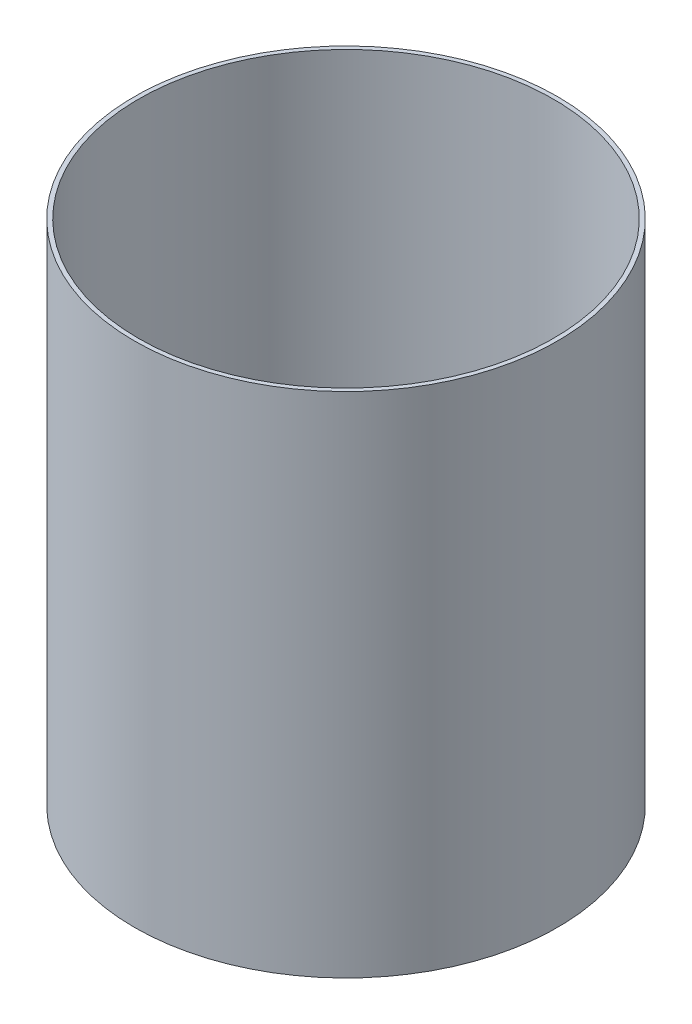
ISO-10303-21;
HEADER;
FILE_DESCRIPTION(('STEP AP214'),'2;1');
FILE_NAME('part.step','',(''),(''),'','','');
FILE_SCHEMA(('AUTOMOTIVE_DESIGN { 1 0 10303 214 1 1 1 1 }'));
ENDSEC;
DATA;
#1=APPLICATION_CONTEXT('core data for automotive mechanical design processes');
#2=APPLICATION_PROTOCOL_DEFINITION('international standard','automotive_design',2000,#1);
#3=PRODUCT_CONTEXT('',#1,'mechanical');
#4=PRODUCT('Part','Part','',(#3));
#5=PRODUCT_RELATED_PRODUCT_CATEGORY('part','',(#4));
#6=PRODUCT_DEFINITION_FORMATION('','',#4);
#7=PRODUCT_DEFINITION_CONTEXT('part definition',#1,'design');
#8=PRODUCT_DEFINITION('design','',#6,#7);
#9=PRODUCT_DEFINITION_SHAPE('','',#8);
#10=(LENGTH_UNIT() NAMED_UNIT(*) SI_UNIT(.MILLI.,.METRE.));
#11=(NAMED_UNIT(*) PLANE_ANGLE_UNIT() SI_UNIT($,.RADIAN.));
#12=(NAMED_UNIT(*) SI_UNIT($,.STERADIAN.) SOLID_ANGLE_UNIT());
#13=UNCERTAINTY_MEASURE_WITH_UNIT(LENGTH_MEASURE(1.E-05),#10,'distance_accuracy_value','');
#14=(GEOMETRIC_REPRESENTATION_CONTEXT(3) GLOBAL_UNCERTAINTY_ASSIGNED_CONTEXT((#13)) GLOBAL_UNIT_ASSIGNED_CONTEXT((#10,
#11,#12)) REPRESENTATION_CONTEXT('',''));
#15=CARTESIAN_POINT('',(0.,0.,0.));
#16=DIRECTION('',(0.,0.,1.));
#17=DIRECTION('',(1.,0.,0.));
#18=AXIS2_PLACEMENT_3D('',#15,#16,#17);
#19=CARTESIAN_POINT('',(0.,300.,0.));
#20=DIRECTION('',(0.,-1.,0.));
#21=DIRECTION('',(0.,0.,-1.));
#22=AXIS2_PLACEMENT_3D('',#19,#20,#21);
#23=CYLINDRICAL_SURFACE('',#22,125.);
#24=CARTESIAN_POINT('',(0.,300.,0.));
#25=DIRECTION('',(0.,1.,0.));
#26=DIRECTION('',(0.,0.,1.));
#27=AXIS2_PLACEMENT_3D('',#24,#25,#26);
#28=CIRCLE('',#27,125.);
#29=CARTESIAN_POINT('',(0.,300.,125.));
#30=VERTEX_POINT('',#29);
#31=EDGE_CURVE('E10',#30,#30,#28,.T.);
#32=ORIENTED_EDGE('',*,*,#31,.F.);
#33=EDGE_LOOP('',(#32));
#34=FACE_BOUND('',#33,.T.);
#35=CARTESIAN_POINT('',(0.,0.,0.));
#36=DIRECTION('',(0.,1.,0.));
#37=DIRECTION('',(0.,0.,1.));
#38=AXIS2_PLACEMENT_3D('',#35,#36,#37);
#39=CIRCLE('',#38,125.);
#40=CARTESIAN_POINT('',(0.,0.,125.));
#41=VERTEX_POINT('',#40);
#42=EDGE_CURVE('E34',#41,#41,#39,.T.);
#43=ORIENTED_EDGE('',*,*,#42,.T.);
#44=EDGE_LOOP('',(#43));
#45=FACE_BOUND('',#44,.T.);
#46=ADVANCED_FACE('F31',(#34,#45),#23,.T.);
#47=CARTESIAN_POINT('',(0.,300.,0.));
#48=DIRECTION('',(0.,1.,0.));
#49=DIRECTION('',(0.,0.,1.));
#50=AXIS2_PLACEMENT_3D('',#47,#48,#49);
#51=PLANE('',#50);
#52=CARTESIAN_POINT('',(0.,300.,0.));
#53=DIRECTION('',(0.,1.,0.));
#54=DIRECTION('',(0.,0.,1.));
#55=AXIS2_PLACEMENT_3D('',#52,#53,#54);
#56=CIRCLE('',#55,122.5);
#57=CARTESIAN_POINT('',(0.,300.,122.5));
#58=VERTEX_POINT('',#57);
#59=EDGE_CURVE('E41',#58,#58,#56,.T.);
#60=ORIENTED_EDGE('',*,*,#59,.F.);
#61=EDGE_LOOP('',(#60));
#62=FACE_BOUND('',#61,.T.);
#63=ORIENTED_EDGE('',*,*,#31,.T.);
#64=EDGE_LOOP('',(#63));
#65=FACE_BOUND('',#64,.T.);
#66=ADVANCED_FACE('F61',(#62,#65),#51,.T.);
#67=CARTESIAN_POINT('',(0.,0.,0.));
#68=DIRECTION('',(0.,1.,0.));
#69=DIRECTION('',(0.,0.,1.));
#70=AXIS2_PLACEMENT_3D('',#67,#68,#69);
#71=PLANE('',#70);
#72=ORIENTED_EDGE('',*,*,#42,.F.);
#73=EDGE_LOOP('',(#72));
#74=FACE_BOUND('',#73,.T.);
#75=ADVANCED_FACE('F53',(#74),#71,.F.);
#76=CARTESIAN_POINT('',(0.,300.,0.));
#77=DIRECTION('',(0.,-1.,0.));
#78=DIRECTION('',(0.,0.,-1.));
#79=AXIS2_PLACEMENT_3D('',#76,#77,#78);
#80=CYLINDRICAL_SURFACE('',#79,122.5);
#81=ORIENTED_EDGE('',*,*,#59,.T.);
#82=EDGE_LOOP('',(#81));
#83=FACE_BOUND('',#82,.T.);
#84=CARTESIAN_POINT('',(0.,2.5,0.));
#85=DIRECTION('',(0.,1.,0.));
#86=DIRECTION('',(0.,0.,1.));
#87=AXIS2_PLACEMENT_3D('',#84,#85,#86);
#88=CIRCLE('',#87,122.5);
#89=CARTESIAN_POINT('',(0.,2.5,122.5));
#90=VERTEX_POINT('',#89);
#91=EDGE_CURVE('E45',#90,#90,#88,.T.);
#92=ORIENTED_EDGE('',*,*,#91,.F.);
#93=EDGE_LOOP('',(#92));
#94=FACE_BOUND('',#93,.T.);
#95=ADVANCED_FACE('F51',(#83,#94),#80,.F.);
#96=CARTESIAN_POINT('',(0.,2.5,0.));
#97=DIRECTION('',(0.,1.,0.));
#98=DIRECTION('',(0.,0.,1.));
#99=AXIS2_PLACEMENT_3D('',#96,#97,#98);
#100=PLANE('',#99);
#101=ORIENTED_EDGE('',*,*,#91,.T.);
#102=EDGE_LOOP('',(#101));
#103=FACE_BOUND('',#102,.T.);
#104=ADVANCED_FACE('F49',(#103),#100,.T.);
#105=CLOSED_SHELL('',(#46,#66,#75,#95,#104));
#106=MANIFOLD_SOLID_BREP('B2',#105);
#107=ADVANCED_BREP_SHAPE_REPRESENTATION('',(#18,#106),#14);
#108=SHAPE_DEFINITION_REPRESENTATION(#9,#107);
ENDSEC;
END-ISO-10303-21;
